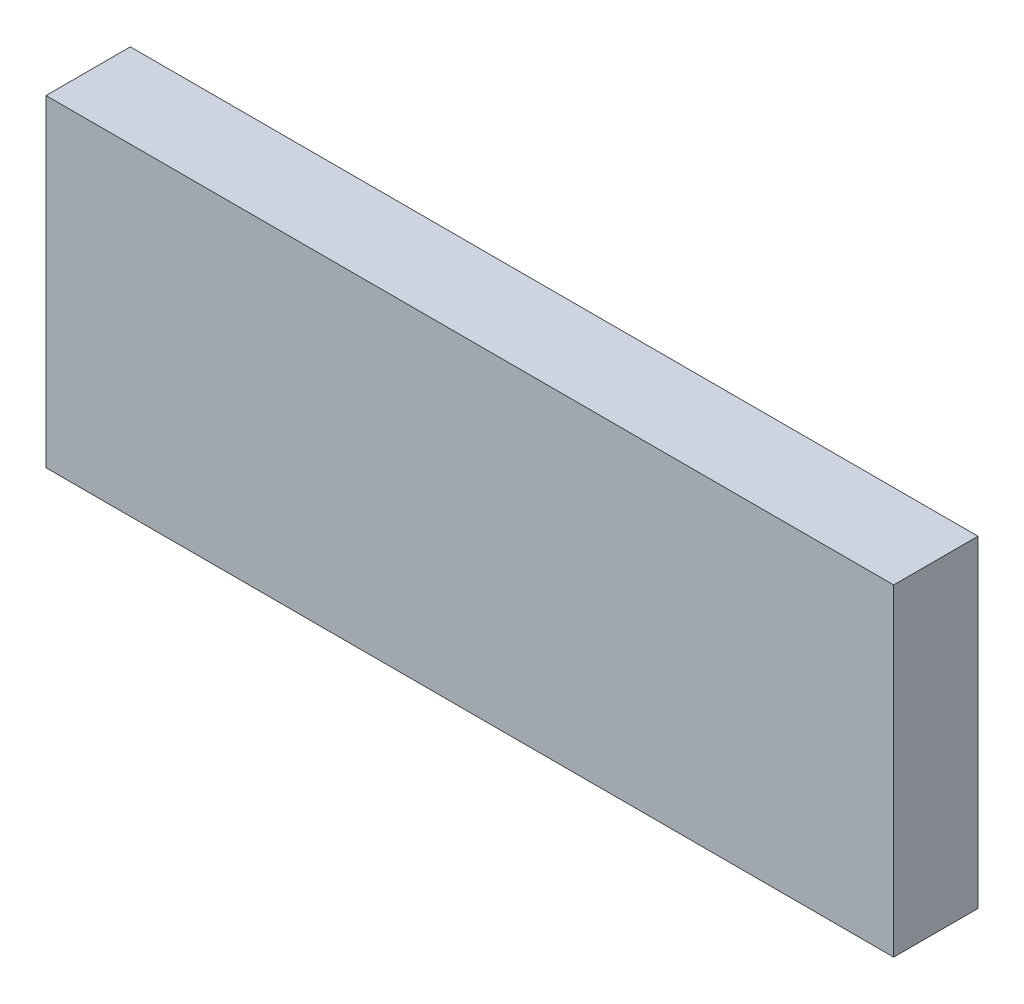
ISO-10303-21;
HEADER;
FILE_DESCRIPTION(('STEP AP214'),'2;1');
FILE_NAME('part.step','',(''),(''),'','','');
FILE_SCHEMA(('AUTOMOTIVE_DESIGN { 1 0 10303 214 1 1 1 1 }'));
ENDSEC;
DATA;
#1=APPLICATION_CONTEXT('core data for automotive mechanical design processes');
#2=APPLICATION_PROTOCOL_DEFINITION('international standard','automotive_design',2000,#1);
#3=PRODUCT_CONTEXT('',#1,'mechanical');
#4=PRODUCT('Part','Part','',(#3));
#5=PRODUCT_RELATED_PRODUCT_CATEGORY('part','',(#4));
#6=PRODUCT_DEFINITION_FORMATION('','',#4);
#7=PRODUCT_DEFINITION_CONTEXT('part definition',#1,'design');
#8=PRODUCT_DEFINITION('design','',#6,#7);
#9=PRODUCT_DEFINITION_SHAPE('','',#8);
#10=(LENGTH_UNIT() NAMED_UNIT(*) SI_UNIT(.MILLI.,.METRE.));
#11=(NAMED_UNIT(*) PLANE_ANGLE_UNIT() SI_UNIT($,.RADIAN.));
#12=(NAMED_UNIT(*) SI_UNIT($,.STERADIAN.) SOLID_ANGLE_UNIT());
#13=UNCERTAINTY_MEASURE_WITH_UNIT(LENGTH_MEASURE(1.E-05),#10,'distance_accuracy_value','');
#14=(GEOMETRIC_REPRESENTATION_CONTEXT(3) GLOBAL_UNCERTAINTY_ASSIGNED_CONTEXT((#13)) GLOBAL_UNIT_ASSIGNED_CONTEXT((#10,
#11,#12)) REPRESENTATION_CONTEXT('',''));
#15=CARTESIAN_POINT('',(0.,0.,0.));
#16=DIRECTION('',(0.,0.,1.));
#17=DIRECTION('',(1.,0.,0.));
#18=AXIS2_PLACEMENT_3D('',#15,#16,#17);
#19=CARTESIAN_POINT('',(48.25,-18.35,4.8));
#20=DIRECTION('',(-1.,0.,0.));
#21=DIRECTION('',(0.,0.,1.));
#22=AXIS2_PLACEMENT_3D('',#19,#20,#21);
#23=PLANE('',#22);
#24=DIRECTION('',(0.,1.,0.));
#25=VECTOR('',#24,1.);
#26=CARTESIAN_POINT('',(48.25,-18.35,-4.8));
#27=LINE('',#26,#25);
#28=CARTESIAN_POINT('',(48.25,-18.35,-4.8));
#29=VERTEX_POINT('',#28);
#30=CARTESIAN_POINT('',(48.25,18.35,-4.8));
#31=VERTEX_POINT('',#30);
#32=EDGE_CURVE('E106',#29,#31,#27,.T.);
#33=ORIENTED_EDGE('',*,*,#32,.T.);
#34=DIRECTION('',(0.,0.,-1.));
#35=VECTOR('',#34,1.);
#36=CARTESIAN_POINT('',(48.25,18.35,4.8));
#37=LINE('',#36,#35);
#38=CARTESIAN_POINT('',(48.25,18.35,4.8));
#39=VERTEX_POINT('',#38);
#40=EDGE_CURVE('E11',#39,#31,#37,.T.);
#41=ORIENTED_EDGE('',*,*,#40,.F.);
#42=DIRECTION('',(0.,1.,0.));
#43=VECTOR('',#42,1.);
#44=CARTESIAN_POINT('',(48.25,-18.35,4.8));
#45=LINE('',#44,#43);
#46=CARTESIAN_POINT('',(48.25,-18.35,4.8));
#47=VERTEX_POINT('',#46);
#48=EDGE_CURVE('E94',#47,#39,#45,.T.);
#49=ORIENTED_EDGE('',*,*,#48,.F.);
#50=DIRECTION('',(0.,0.,-1.));
#51=VECTOR('',#50,1.);
#52=CARTESIAN_POINT('',(48.25,-18.35,4.8));
#53=LINE('',#52,#51);
#54=EDGE_CURVE('E102',#47,#29,#53,.T.);
#55=ORIENTED_EDGE('',*,*,#54,.T.);
#56=EDGE_LOOP('',(#33,#41,#49,#55));
#57=FACE_BOUND('',#56,.T.);
#58=ADVANCED_FACE('F43',(#57),#23,.F.);
#59=CARTESIAN_POINT('',(-48.25,18.35,4.8));
#60=DIRECTION('',(0.,-1.,0.));
#61=DIRECTION('',(0.,0.,-1.));
#62=AXIS2_PLACEMENT_3D('',#59,#60,#61);
#63=PLANE('',#62);
#64=DIRECTION('',(-1.,0.,0.));
#65=VECTOR('',#64,1.);
#66=CARTESIAN_POINT('',(-48.25,18.35,-4.8));
#67=LINE('',#66,#65);
#68=CARTESIAN_POINT('',(-48.25,18.35,-4.8));
#69=VERTEX_POINT('',#68);
#70=EDGE_CURVE('E98',#31,#69,#67,.T.);
#71=ORIENTED_EDGE('',*,*,#70,.T.);
#72=DIRECTION('',(0.,0.,-1.));
#73=VECTOR('',#72,1.);
#74=CARTESIAN_POINT('',(-48.25,18.35,4.8));
#75=LINE('',#74,#73);
#76=CARTESIAN_POINT('',(-48.25,18.35,4.8));
#77=VERTEX_POINT('',#76);
#78=EDGE_CURVE('E51',#77,#69,#75,.T.);
#79=ORIENTED_EDGE('',*,*,#78,.F.);
#80=DIRECTION('',(-1.,0.,0.));
#81=VECTOR('',#80,1.);
#82=CARTESIAN_POINT('',(-48.25,18.35,4.8));
#83=LINE('',#82,#81);
#84=EDGE_CURVE('E89',#39,#77,#83,.T.);
#85=ORIENTED_EDGE('',*,*,#84,.F.);
#86=ORIENTED_EDGE('',*,*,#40,.T.);
#87=EDGE_LOOP('',(#71,#79,#85,#86));
#88=FACE_BOUND('',#87,.T.);
#89=ADVANCED_FACE('F97',(#88),#63,.F.);
#90=CARTESIAN_POINT('',(-48.25,-18.35,4.8));
#91=DIRECTION('',(1.,0.,0.));
#92=DIRECTION('',(0.,0.,-1.));
#93=AXIS2_PLACEMENT_3D('',#90,#91,#92);
#94=PLANE('',#93);
#95=DIRECTION('',(0.,-1.,0.));
#96=VECTOR('',#95,1.);
#97=CARTESIAN_POINT('',(-48.25,-18.35,-4.8));
#98=LINE('',#97,#96);
#99=CARTESIAN_POINT('',(-48.25,-18.35,-4.8));
#100=VERTEX_POINT('',#99);
#101=EDGE_CURVE('E76',#69,#100,#98,.T.);
#102=ORIENTED_EDGE('',*,*,#101,.T.);
#103=DIRECTION('',(0.,0.,-1.));
#104=VECTOR('',#103,1.);
#105=CARTESIAN_POINT('',(-48.25,-18.35,4.8));
#106=LINE('',#105,#104);
#107=CARTESIAN_POINT('',(-48.25,-18.35,4.8));
#108=VERTEX_POINT('',#107);
#109=EDGE_CURVE('E99',#108,#100,#106,.T.);
#110=ORIENTED_EDGE('',*,*,#109,.F.);
#111=DIRECTION('',(0.,-1.,0.));
#112=VECTOR('',#111,1.);
#113=CARTESIAN_POINT('',(-48.25,-18.35,4.8));
#114=LINE('',#113,#112);
#115=EDGE_CURVE('E92',#77,#108,#114,.T.);
#116=ORIENTED_EDGE('',*,*,#115,.F.);
#117=ORIENTED_EDGE('',*,*,#78,.T.);
#118=EDGE_LOOP('',(#102,#110,#116,#117));
#119=FACE_BOUND('',#118,.T.);
#120=ADVANCED_FACE('F100',(#119),#94,.F.);
#121=CARTESIAN_POINT('',(-48.25,-18.35,4.8));
#122=DIRECTION('',(0.,1.,0.));
#123=DIRECTION('',(0.,0.,1.));
#124=AXIS2_PLACEMENT_3D('',#121,#122,#123);
#125=PLANE('',#124);
#126=DIRECTION('',(1.,0.,0.));
#127=VECTOR('',#126,1.);
#128=CARTESIAN_POINT('',(-48.25,-18.35,-4.8));
#129=LINE('',#128,#127);
#130=EDGE_CURVE('E82',#100,#29,#129,.T.);
#131=ORIENTED_EDGE('',*,*,#130,.T.);
#132=ORIENTED_EDGE('',*,*,#54,.F.);
#133=DIRECTION('',(1.,0.,0.));
#134=VECTOR('',#133,1.);
#135=CARTESIAN_POINT('',(-48.25,-18.35,4.8));
#136=LINE('',#135,#134);
#137=EDGE_CURVE('E59',#108,#47,#136,.T.);
#138=ORIENTED_EDGE('',*,*,#137,.F.);
#139=ORIENTED_EDGE('',*,*,#109,.T.);
#140=EDGE_LOOP('',(#131,#132,#138,#139));
#141=FACE_BOUND('',#140,.T.);
#142=ADVANCED_FACE('F113',(#141),#125,.F.);
#143=CARTESIAN_POINT('',(0.,0.,4.8));
#144=DIRECTION('',(0.,0.,-1.));
#145=DIRECTION('',(-1.,0.,0.));
#146=AXIS2_PLACEMENT_3D('',#143,#144,#145);
#147=PLANE('',#146);
#148=ORIENTED_EDGE('',*,*,#48,.T.);
#149=ORIENTED_EDGE('',*,*,#84,.T.);
#150=ORIENTED_EDGE('',*,*,#115,.T.);
#151=ORIENTED_EDGE('',*,*,#137,.T.);
#152=EDGE_LOOP('',(#148,#149,#150,#151));
#153=FACE_BOUND('',#152,.T.);
#154=ADVANCED_FACE('F90',(#153),#147,.F.);
#155=CARTESIAN_POINT('',(0.,0.,-4.8));
#156=DIRECTION('',(0.,0.,-1.));
#157=DIRECTION('',(-1.,0.,0.));
#158=AXIS2_PLACEMENT_3D('',#155,#156,#157);
#159=PLANE('',#158);
#160=ORIENTED_EDGE('',*,*,#32,.F.);
#161=ORIENTED_EDGE('',*,*,#130,.F.);
#162=ORIENTED_EDGE('',*,*,#101,.F.);
#163=ORIENTED_EDGE('',*,*,#70,.F.);
#164=EDGE_LOOP('',(#160,#161,#162,#163));
#165=FACE_BOUND('',#164,.T.);
#166=ADVANCED_FACE('F116',(#165),#159,.T.);
#167=CLOSED_SHELL('',(#58,#89,#120,#142,#154,#166));
#168=MANIFOLD_SOLID_BREP('B2',#167);
#169=ADVANCED_BREP_SHAPE_REPRESENTATION('',(#18,#168),#14);
#170=SHAPE_DEFINITION_REPRESENTATION(#9,#169);
ENDSEC;
END-ISO-10303-21;
